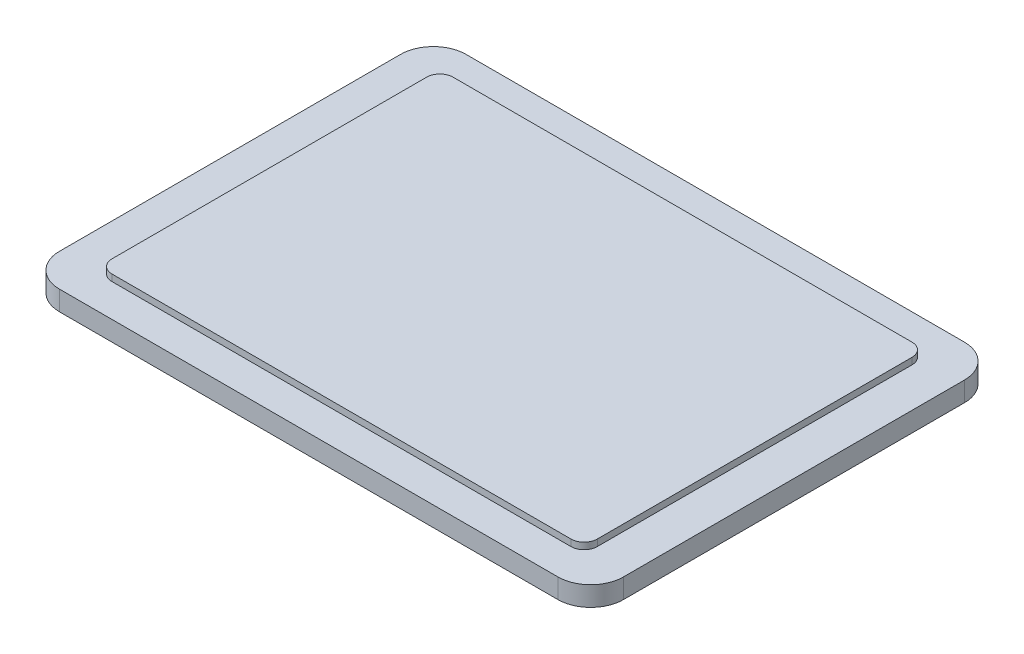
ISO-10303-21;
HEADER;
FILE_DESCRIPTION(('STEP AP214'),'2;1');
FILE_NAME('part.step','',(''),(''),'','','');
FILE_SCHEMA(('AUTOMOTIVE_DESIGN { 1 0 10303 214 1 1 1 1 }'));
ENDSEC;
DATA;
#1=APPLICATION_CONTEXT('core data for automotive mechanical design processes');
#2=APPLICATION_PROTOCOL_DEFINITION('international standard','automotive_design',2000,#1);
#3=PRODUCT_CONTEXT('',#1,'mechanical');
#4=PRODUCT('Part','Part','',(#3));
#5=PRODUCT_RELATED_PRODUCT_CATEGORY('part','',(#4));
#6=PRODUCT_DEFINITION_FORMATION('','',#4);
#7=PRODUCT_DEFINITION_CONTEXT('part definition',#1,'design');
#8=PRODUCT_DEFINITION('design','',#6,#7);
#9=PRODUCT_DEFINITION_SHAPE('','',#8);
#10=(LENGTH_UNIT() NAMED_UNIT(*) SI_UNIT(.MILLI.,.METRE.));
#11=(NAMED_UNIT(*) PLANE_ANGLE_UNIT() SI_UNIT($,.RADIAN.));
#12=(NAMED_UNIT(*) SI_UNIT($,.STERADIAN.) SOLID_ANGLE_UNIT());
#13=UNCERTAINTY_MEASURE_WITH_UNIT(LENGTH_MEASURE(1.E-05),#10,'distance_accuracy_value','');
#14=(GEOMETRIC_REPRESENTATION_CONTEXT(3) GLOBAL_UNCERTAINTY_ASSIGNED_CONTEXT((#13)) GLOBAL_UNIT_ASSIGNED_CONTEXT((#10,
#11,#12)) REPRESENTATION_CONTEXT('',''));
#15=CARTESIAN_POINT('',(0.,0.,0.));
#16=DIRECTION('',(0.,0.,1.));
#17=DIRECTION('',(1.,0.,0.));
#18=AXIS2_PLACEMENT_3D('',#15,#16,#17);
#19=CARTESIAN_POINT('',(-43.,3.,31.));
#20=DIRECTION('',(1.,0.,0.));
#21=DIRECTION('',(0.,0.,-1.));
#22=AXIS2_PLACEMENT_3D('',#19,#20,#21);
#23=PLANE('',#22);
#24=DIRECTION('',(0.,0.,1.));
#25=VECTOR('',#24,1.);
#26=CARTESIAN_POINT('',(-43.,3.,31.));
#27=LINE('',#26,#25);
#28=CARTESIAN_POINT('',(-43.,3.,-26.));
#29=VERTEX_POINT('',#28);
#30=CARTESIAN_POINT('',(-43.,3.,26.));
#31=VERTEX_POINT('',#30);
#32=EDGE_CURVE('E165',#29,#31,#27,.T.);
#33=ORIENTED_EDGE('',*,*,#32,.F.);
#34=DIRECTION('',(0.,-1.,0.));
#35=VECTOR('',#34,1.);
#36=CARTESIAN_POINT('',(-43.,3.,-26.));
#37=LINE('',#36,#35);
#38=CARTESIAN_POINT('',(-43.,0.,-26.));
#39=VERTEX_POINT('',#38);
#40=EDGE_CURVE('E150',#29,#39,#37,.T.);
#41=ORIENTED_EDGE('',*,*,#40,.T.);
#42=DIRECTION('',(0.,0.,1.));
#43=VECTOR('',#42,1.);
#44=CARTESIAN_POINT('',(-43.,0.,31.));
#45=LINE('',#44,#43);
#46=CARTESIAN_POINT('',(-43.,0.,26.));
#47=VERTEX_POINT('',#46);
#48=EDGE_CURVE('E162',#39,#47,#45,.T.);
#49=ORIENTED_EDGE('',*,*,#48,.T.);
#50=DIRECTION('',(0.,-1.,0.));
#51=VECTOR('',#50,1.);
#52=CARTESIAN_POINT('',(-43.,3.,26.));
#53=LINE('',#52,#51);
#54=EDGE_CURVE('E167',#47,#31,#53,.F.);
#55=ORIENTED_EDGE('',*,*,#54,.T.);
#56=EDGE_LOOP('',(#33,#41,#49,#55));
#57=FACE_BOUND('',#56,.T.);
#58=ADVANCED_FACE('F34',(#57),#23,.F.);
#59=CARTESIAN_POINT('',(43.,3.,31.));
#60=DIRECTION('',(0.,0.,-1.));
#61=DIRECTION('',(-1.,0.,0.));
#62=AXIS2_PLACEMENT_3D('',#59,#60,#61);
#63=PLANE('',#62);
#64=DIRECTION('',(1.,0.,0.));
#65=VECTOR('',#64,1.);
#66=CARTESIAN_POINT('',(43.,0.,31.));
#67=LINE('',#66,#65);
#68=CARTESIAN_POINT('',(-38.,0.,31.));
#69=VERTEX_POINT('',#68);
#70=CARTESIAN_POINT('',(38.,0.,31.));
#71=VERTEX_POINT('',#70);
#72=EDGE_CURVE('E171',#69,#71,#67,.T.);
#73=ORIENTED_EDGE('',*,*,#72,.T.);
#74=DIRECTION('',(0.,-1.,0.));
#75=VECTOR('',#74,1.);
#76=CARTESIAN_POINT('',(38.,3.,31.));
#77=LINE('',#76,#75);
#78=CARTESIAN_POINT('',(38.,3.,31.));
#79=VERTEX_POINT('',#78);
#80=EDGE_CURVE('E212',#71,#79,#77,.F.);
#81=ORIENTED_EDGE('',*,*,#80,.T.);
#82=DIRECTION('',(1.,0.,0.));
#83=VECTOR('',#82,1.);
#84=CARTESIAN_POINT('',(43.,3.,31.));
#85=LINE('',#84,#83);
#86=CARTESIAN_POINT('',(-38.,3.,31.));
#87=VERTEX_POINT('',#86);
#88=EDGE_CURVE('E288',#87,#79,#85,.T.);
#89=ORIENTED_EDGE('',*,*,#88,.F.);
#90=DIRECTION('',(0.,-1.,0.));
#91=VECTOR('',#90,1.);
#92=CARTESIAN_POINT('',(-38.,3.,31.));
#93=LINE('',#92,#91);
#94=EDGE_CURVE('E209',#87,#69,#93,.T.);
#95=ORIENTED_EDGE('',*,*,#94,.T.);
#96=EDGE_LOOP('',(#73,#81,#89,#95));
#97=FACE_BOUND('',#96,.T.);
#98=ADVANCED_FACE('F311',(#97),#63,.F.);
#99=CARTESIAN_POINT('',(43.,3.,31.));
#100=DIRECTION('',(-1.,0.,0.));
#101=DIRECTION('',(0.,0.,1.));
#102=AXIS2_PLACEMENT_3D('',#99,#100,#101);
#103=PLANE('',#102);
#104=DIRECTION('',(0.,0.,-1.));
#105=VECTOR('',#104,1.);
#106=CARTESIAN_POINT('',(43.,0.,31.));
#107=LINE('',#106,#105);
#108=CARTESIAN_POINT('',(43.,0.,26.));
#109=VERTEX_POINT('',#108);
#110=CARTESIAN_POINT('',(43.,0.,-26.));
#111=VERTEX_POINT('',#110);
#112=EDGE_CURVE('E175',#109,#111,#107,.T.);
#113=ORIENTED_EDGE('',*,*,#112,.T.);
#114=DIRECTION('',(0.,-1.,0.));
#115=VECTOR('',#114,1.);
#116=CARTESIAN_POINT('',(43.,3.,-26.));
#117=LINE('',#116,#115);
#118=CARTESIAN_POINT('',(43.,3.,-26.));
#119=VERTEX_POINT('',#118);
#120=EDGE_CURVE('E207',#111,#119,#117,.F.);
#121=ORIENTED_EDGE('',*,*,#120,.T.);
#122=DIRECTION('',(0.,0.,-1.));
#123=VECTOR('',#122,1.);
#124=CARTESIAN_POINT('',(43.,3.,31.));
#125=LINE('',#124,#123);
#126=CARTESIAN_POINT('',(43.,3.,26.));
#127=VERTEX_POINT('',#126);
#128=EDGE_CURVE('E290',#127,#119,#125,.T.);
#129=ORIENTED_EDGE('',*,*,#128,.F.);
#130=DIRECTION('',(0.,-1.,0.));
#131=VECTOR('',#130,1.);
#132=CARTESIAN_POINT('',(43.,3.,26.));
#133=LINE('',#132,#131);
#134=EDGE_CURVE('E204',#127,#109,#133,.T.);
#135=ORIENTED_EDGE('',*,*,#134,.T.);
#136=EDGE_LOOP('',(#113,#121,#129,#135));
#137=FACE_BOUND('',#136,.T.);
#138=ADVANCED_FACE('F304',(#137),#103,.F.);
#139=CARTESIAN_POINT('',(43.,3.,-31.));
#140=DIRECTION('',(0.,0.,1.));
#141=DIRECTION('',(1.,0.,0.));
#142=AXIS2_PLACEMENT_3D('',#139,#140,#141);
#143=PLANE('',#142);
#144=DIRECTION('',(-1.,0.,0.));
#145=VECTOR('',#144,1.);
#146=CARTESIAN_POINT('',(43.,0.,-31.));
#147=LINE('',#146,#145);
#148=CARTESIAN_POINT('',(38.,0.,-31.));
#149=VERTEX_POINT('',#148);
#150=CARTESIAN_POINT('',(-38.,0.,-31.));
#151=VERTEX_POINT('',#150);
#152=EDGE_CURVE('E186',#149,#151,#147,.T.);
#153=ORIENTED_EDGE('',*,*,#152,.T.);
#154=DIRECTION('',(0.,-1.,0.));
#155=VECTOR('',#154,1.);
#156=CARTESIAN_POINT('',(-38.,3.,-31.));
#157=LINE('',#156,#155);
#158=CARTESIAN_POINT('',(-38.,3.,-31.));
#159=VERTEX_POINT('',#158);
#160=EDGE_CURVE('E151',#151,#159,#157,.F.);
#161=ORIENTED_EDGE('',*,*,#160,.T.);
#162=DIRECTION('',(-1.,0.,0.));
#163=VECTOR('',#162,1.);
#164=CARTESIAN_POINT('',(43.,3.,-31.));
#165=LINE('',#164,#163);
#166=CARTESIAN_POINT('',(38.,3.,-31.));
#167=VERTEX_POINT('',#166);
#168=EDGE_CURVE('E181',#167,#159,#165,.T.);
#169=ORIENTED_EDGE('',*,*,#168,.F.);
#170=DIRECTION('',(0.,-1.,0.));
#171=VECTOR('',#170,1.);
#172=CARTESIAN_POINT('',(38.,3.,-31.));
#173=LINE('',#172,#171);
#174=EDGE_CURVE('E156',#167,#149,#173,.T.);
#175=ORIENTED_EDGE('',*,*,#174,.T.);
#176=EDGE_LOOP('',(#153,#161,#169,#175));
#177=FACE_BOUND('',#176,.T.);
#178=ADVANCED_FACE('F298',(#177),#143,.F.);
#179=CARTESIAN_POINT('',(0.,3.,0.));
#180=DIRECTION('',(0.,1.,0.));
#181=DIRECTION('',(0.,0.,1.));
#182=AXIS2_PLACEMENT_3D('',#179,#180,#181);
#183=PLANE('',#182);
#184=DIRECTION('',(0.,0.,1.));
#185=VECTOR('',#184,1.);
#186=CARTESIAN_POINT('',(-37.,3.,26.));
#187=LINE('',#186,#185);
#188=CARTESIAN_POINT('',(-37.,3.,-24.));
#189=VERTEX_POINT('',#188);
#190=CARTESIAN_POINT('',(-37.,3.,24.));
#191=VERTEX_POINT('',#190);
#192=EDGE_CURVE('E283',#189,#191,#187,.T.);
#193=ORIENTED_EDGE('',*,*,#192,.F.);
#194=CARTESIAN_POINT('',(-35.,3.,-24.));
#195=DIRECTION('',(0.,1.,0.));
#196=DIRECTION('',(0.,0.,1.));
#197=AXIS2_PLACEMENT_3D('',#194,#195,#196);
#198=CIRCLE('',#197,2.);
#199=CARTESIAN_POINT('',(-35.,3.,-26.));
#200=VERTEX_POINT('',#199);
#201=EDGE_CURVE('E11',#189,#200,#198,.F.);
#202=ORIENTED_EDGE('',*,*,#201,.T.);
#203=DIRECTION('',(-1.,0.,0.));
#204=VECTOR('',#203,1.);
#205=CARTESIAN_POINT('',(37.,3.,-26.));
#206=LINE('',#205,#204);
#207=CARTESIAN_POINT('',(35.,3.,-26.));
#208=VERTEX_POINT('',#207);
#209=EDGE_CURVE('E249',#208,#200,#206,.T.);
#210=ORIENTED_EDGE('',*,*,#209,.F.);
#211=CARTESIAN_POINT('',(35.,3.,-24.));
#212=DIRECTION('',(0.,1.,0.));
#213=DIRECTION('',(0.,0.,1.));
#214=AXIS2_PLACEMENT_3D('',#211,#212,#213);
#215=CIRCLE('',#214,2.);
#216=CARTESIAN_POINT('',(37.,3.,-24.));
#217=VERTEX_POINT('',#216);
#218=EDGE_CURVE('E42',#208,#217,#215,.F.);
#219=ORIENTED_EDGE('',*,*,#218,.T.);
#220=DIRECTION('',(0.,0.,-1.));
#221=VECTOR('',#220,1.);
#222=CARTESIAN_POINT('',(37.,3.,26.));
#223=LINE('',#222,#221);
#224=CARTESIAN_POINT('',(37.,3.,24.));
#225=VERTEX_POINT('',#224);
#226=EDGE_CURVE('E248',#225,#217,#223,.T.);
#227=ORIENTED_EDGE('',*,*,#226,.F.);
#228=CARTESIAN_POINT('',(35.,3.,24.));
#229=DIRECTION('',(0.,1.,0.));
#230=DIRECTION('',(0.,0.,1.));
#231=AXIS2_PLACEMENT_3D('',#228,#229,#230);
#232=CIRCLE('',#231,2.);
#233=CARTESIAN_POINT('',(35.,3.,26.));
#234=VERTEX_POINT('',#233);
#235=EDGE_CURVE('E241',#225,#234,#232,.F.);
#236=ORIENTED_EDGE('',*,*,#235,.T.);
#237=DIRECTION('',(1.,0.,0.));
#238=VECTOR('',#237,1.);
#239=CARTESIAN_POINT('',(37.,3.,26.));
#240=LINE('',#239,#238);
#241=CARTESIAN_POINT('',(-35.,3.,26.));
#242=VERTEX_POINT('',#241);
#243=EDGE_CURVE('E255',#242,#234,#240,.T.);
#244=ORIENTED_EDGE('',*,*,#243,.F.);
#245=CARTESIAN_POINT('',(-35.,3.,24.));
#246=DIRECTION('',(0.,1.,0.));
#247=DIRECTION('',(0.,0.,1.));
#248=AXIS2_PLACEMENT_3D('',#245,#246,#247);
#249=CIRCLE('',#248,2.);
#250=EDGE_CURVE('E243',#242,#191,#249,.F.);
#251=ORIENTED_EDGE('',*,*,#250,.T.);
#252=EDGE_LOOP('',(#193,#202,#210,#219,#227,#236,#244,#251));
#253=FACE_BOUND('',#252,.T.);
#254=ORIENTED_EDGE('',*,*,#168,.T.);
#255=CARTESIAN_POINT('',(-38.,3.,-26.));
#256=DIRECTION('',(0.,1.,0.));
#257=DIRECTION('',(0.,0.,1.));
#258=AXIS2_PLACEMENT_3D('',#255,#256,#257);
#259=CIRCLE('',#258,5.);
#260=EDGE_CURVE('E202',#159,#29,#259,.T.);
#261=ORIENTED_EDGE('',*,*,#260,.T.);
#262=ORIENTED_EDGE('',*,*,#32,.T.);
#263=CARTESIAN_POINT('',(-38.,3.,26.));
#264=DIRECTION('',(0.,1.,0.));
#265=DIRECTION('',(0.,0.,1.));
#266=AXIS2_PLACEMENT_3D('',#263,#264,#265);
#267=CIRCLE('',#266,5.);
#268=EDGE_CURVE('E196',#31,#87,#267,.T.);
#269=ORIENTED_EDGE('',*,*,#268,.T.);
#270=ORIENTED_EDGE('',*,*,#88,.T.);
#271=CARTESIAN_POINT('',(38.,3.,26.));
#272=DIRECTION('',(0.,1.,0.));
#273=DIRECTION('',(0.,0.,1.));
#274=AXIS2_PLACEMENT_3D('',#271,#272,#273);
#275=CIRCLE('',#274,5.);
#276=EDGE_CURVE('E198',#79,#127,#275,.T.);
#277=ORIENTED_EDGE('',*,*,#276,.T.);
#278=ORIENTED_EDGE('',*,*,#128,.T.);
#279=CARTESIAN_POINT('',(38.,3.,-26.));
#280=DIRECTION('',(0.,1.,0.));
#281=DIRECTION('',(0.,0.,1.));
#282=AXIS2_PLACEMENT_3D('',#279,#280,#281);
#283=CIRCLE('',#282,5.);
#284=EDGE_CURVE('E200',#119,#167,#283,.T.);
#285=ORIENTED_EDGE('',*,*,#284,.T.);
#286=EDGE_LOOP('',(#254,#261,#262,#269,#270,#277,#278,#285));
#287=FACE_BOUND('',#286,.T.);
#288=ADVANCED_FACE('F246',(#253,#287),#183,.T.);
#289=CARTESIAN_POINT('',(0.,0.,0.));
#290=DIRECTION('',(0.,1.,0.));
#291=DIRECTION('',(0.,0.,1.));
#292=AXIS2_PLACEMENT_3D('',#289,#290,#291);
#293=PLANE('',#292);
#294=ORIENTED_EDGE('',*,*,#48,.F.);
#295=CARTESIAN_POINT('',(-38.,0.,-26.));
#296=DIRECTION('',(0.,1.,0.));
#297=DIRECTION('',(0.,0.,1.));
#298=AXIS2_PLACEMENT_3D('',#295,#296,#297);
#299=CIRCLE('',#298,5.);
#300=EDGE_CURVE('E146',#39,#151,#299,.F.);
#301=ORIENTED_EDGE('',*,*,#300,.T.);
#302=ORIENTED_EDGE('',*,*,#152,.F.);
#303=CARTESIAN_POINT('',(38.,0.,-26.));
#304=DIRECTION('',(0.,1.,0.));
#305=DIRECTION('',(0.,0.,1.));
#306=AXIS2_PLACEMENT_3D('',#303,#304,#305);
#307=CIRCLE('',#306,5.);
#308=EDGE_CURVE('E157',#149,#111,#307,.F.);
#309=ORIENTED_EDGE('',*,*,#308,.T.);
#310=ORIENTED_EDGE('',*,*,#112,.F.);
#311=CARTESIAN_POINT('',(38.,0.,26.));
#312=DIRECTION('',(0.,1.,0.));
#313=DIRECTION('',(0.,0.,1.));
#314=AXIS2_PLACEMENT_3D('',#311,#312,#313);
#315=CIRCLE('',#314,5.);
#316=EDGE_CURVE('E190',#109,#71,#315,.F.);
#317=ORIENTED_EDGE('',*,*,#316,.T.);
#318=ORIENTED_EDGE('',*,*,#72,.F.);
#319=CARTESIAN_POINT('',(-38.,0.,26.));
#320=DIRECTION('',(0.,1.,0.));
#321=DIRECTION('',(0.,0.,1.));
#322=AXIS2_PLACEMENT_3D('',#319,#320,#321);
#323=CIRCLE('',#322,5.);
#324=EDGE_CURVE('E166',#69,#47,#323,.F.);
#325=ORIENTED_EDGE('',*,*,#324,.T.);
#326=EDGE_LOOP('',(#294,#301,#302,#309,#310,#317,#318,#325));
#327=FACE_BOUND('',#326,.T.);
#328=ADVANCED_FACE('F169',(#327),#293,.F.);
#329=CARTESIAN_POINT('',(-37.,4.,26.));
#330=DIRECTION('',(1.,0.,0.));
#331=DIRECTION('',(0.,0.,-1.));
#332=AXIS2_PLACEMENT_3D('',#329,#330,#331);
#333=PLANE('',#332);
#334=ORIENTED_EDGE('',*,*,#192,.T.);
#335=DIRECTION('',(0.,-1.,0.));
#336=VECTOR('',#335,1.);
#337=CARTESIAN_POINT('',(-37.,4.,24.));
#338=LINE('',#337,#336);
#339=CARTESIAN_POINT('',(-37.,4.,24.));
#340=VERTEX_POINT('',#339);
#341=EDGE_CURVE('E235',#191,#340,#338,.F.);
#342=ORIENTED_EDGE('',*,*,#341,.T.);
#343=DIRECTION('',(0.,0.,1.));
#344=VECTOR('',#343,1.);
#345=CARTESIAN_POINT('',(-37.,4.,26.));
#346=LINE('',#345,#344);
#347=CARTESIAN_POINT('',(-37.,4.,-24.));
#348=VERTEX_POINT('',#347);
#349=EDGE_CURVE('E271',#348,#340,#346,.T.);
#350=ORIENTED_EDGE('',*,*,#349,.F.);
#351=DIRECTION('',(0.,-1.,0.));
#352=VECTOR('',#351,1.);
#353=CARTESIAN_POINT('',(-37.,4.,-24.));
#354=LINE('',#353,#352);
#355=EDGE_CURVE('E232',#348,#189,#354,.T.);
#356=ORIENTED_EDGE('',*,*,#355,.T.);
#357=EDGE_LOOP('',(#334,#342,#350,#356));
#358=FACE_BOUND('',#357,.T.);
#359=ADVANCED_FACE('F275',(#358),#333,.F.);
#360=CARTESIAN_POINT('',(37.,4.,26.));
#361=DIRECTION('',(0.,0.,-1.));
#362=DIRECTION('',(-1.,0.,0.));
#363=AXIS2_PLACEMENT_3D('',#360,#361,#362);
#364=PLANE('',#363);
#365=ORIENTED_EDGE('',*,*,#243,.T.);
#366=DIRECTION('',(0.,-1.,0.));
#367=VECTOR('',#366,1.);
#368=CARTESIAN_POINT('',(35.,4.,26.));
#369=LINE('',#368,#367);
#370=CARTESIAN_POINT('',(35.,4.,26.));
#371=VERTEX_POINT('',#370);
#372=EDGE_CURVE('E222',#234,#371,#369,.F.);
#373=ORIENTED_EDGE('',*,*,#372,.T.);
#374=DIRECTION('',(1.,0.,0.));
#375=VECTOR('',#374,1.);
#376=CARTESIAN_POINT('',(37.,4.,26.));
#377=LINE('',#376,#375);
#378=CARTESIAN_POINT('',(-35.,4.,26.));
#379=VERTEX_POINT('',#378);
#380=EDGE_CURVE('E277',#379,#371,#377,.T.);
#381=ORIENTED_EDGE('',*,*,#380,.F.);
#382=DIRECTION('',(0.,-1.,0.));
#383=VECTOR('',#382,1.);
#384=CARTESIAN_POINT('',(-35.,4.,26.));
#385=LINE('',#384,#383);
#386=EDGE_CURVE('E219',#379,#242,#385,.T.);
#387=ORIENTED_EDGE('',*,*,#386,.T.);
#388=EDGE_LOOP('',(#365,#373,#381,#387));
#389=FACE_BOUND('',#388,.T.);
#390=ADVANCED_FACE('F374',(#389),#364,.F.);
#391=CARTESIAN_POINT('',(37.,4.,26.));
#392=DIRECTION('',(-1.,0.,0.));
#393=DIRECTION('',(0.,0.,1.));
#394=AXIS2_PLACEMENT_3D('',#391,#392,#393);
#395=PLANE('',#394);
#396=DIRECTION('',(0.,0.,-1.));
#397=VECTOR('',#396,1.);
#398=CARTESIAN_POINT('',(37.,4.,26.));
#399=LINE('',#398,#397);
#400=CARTESIAN_POINT('',(37.,4.,24.));
#401=VERTEX_POINT('',#400);
#402=CARTESIAN_POINT('',(37.,4.,-24.));
#403=VERTEX_POINT('',#402);
#404=EDGE_CURVE('E178',#401,#403,#399,.T.);
#405=ORIENTED_EDGE('',*,*,#404,.F.);
#406=DIRECTION('',(0.,-1.,0.));
#407=VECTOR('',#406,1.);
#408=CARTESIAN_POINT('',(37.,4.,24.));
#409=LINE('',#408,#407);
#410=EDGE_CURVE('E216',#401,#225,#409,.T.);
#411=ORIENTED_EDGE('',*,*,#410,.T.);
#412=ORIENTED_EDGE('',*,*,#226,.T.);
#413=DIRECTION('',(0.,-1.,0.));
#414=VECTOR('',#413,1.);
#415=CARTESIAN_POINT('',(37.,4.,-24.));
#416=LINE('',#415,#414);
#417=EDGE_CURVE('E214',#217,#403,#416,.F.);
#418=ORIENTED_EDGE('',*,*,#417,.T.);
#419=EDGE_LOOP('',(#405,#411,#412,#418));
#420=FACE_BOUND('',#419,.T.);
#421=ADVANCED_FACE('F252',(#420),#395,.F.);
#422=CARTESIAN_POINT('',(37.,4.,-26.));
#423=DIRECTION('',(0.,0.,1.));
#424=DIRECTION('',(1.,0.,0.));
#425=AXIS2_PLACEMENT_3D('',#422,#423,#424);
#426=PLANE('',#425);
#427=DIRECTION('',(-1.,0.,0.));
#428=VECTOR('',#427,1.);
#429=CARTESIAN_POINT('',(37.,4.,-26.));
#430=LINE('',#429,#428);
#431=CARTESIAN_POINT('',(35.,4.,-26.));
#432=VERTEX_POINT('',#431);
#433=CARTESIAN_POINT('',(-35.,4.,-26.));
#434=VERTEX_POINT('',#433);
#435=EDGE_CURVE('E172',#432,#434,#430,.T.);
#436=ORIENTED_EDGE('',*,*,#435,.F.);
#437=DIRECTION('',(0.,-1.,0.));
#438=VECTOR('',#437,1.);
#439=CARTESIAN_POINT('',(35.,4.,-26.));
#440=LINE('',#439,#438);
#441=EDGE_CURVE('E239',#432,#208,#440,.T.);
#442=ORIENTED_EDGE('',*,*,#441,.T.);
#443=ORIENTED_EDGE('',*,*,#209,.T.);
#444=DIRECTION('',(0.,-1.,0.));
#445=VECTOR('',#444,1.);
#446=CARTESIAN_POINT('',(-35.,4.,-26.));
#447=LINE('',#446,#445);
#448=EDGE_CURVE('E237',#200,#434,#447,.F.);
#449=ORIENTED_EDGE('',*,*,#448,.T.);
#450=EDGE_LOOP('',(#436,#442,#443,#449));
#451=FACE_BOUND('',#450,.T.);
#452=ADVANCED_FACE('F265',(#451),#426,.F.);
#453=CARTESIAN_POINT('',(0.,4.,0.));
#454=DIRECTION('',(0.,1.,0.));
#455=DIRECTION('',(0.,0.,1.));
#456=AXIS2_PLACEMENT_3D('',#453,#454,#455);
#457=PLANE('',#456);
#458=ORIENTED_EDGE('',*,*,#380,.T.);
#459=CARTESIAN_POINT('',(35.,4.,24.));
#460=DIRECTION('',(0.,1.,0.));
#461=DIRECTION('',(0.,0.,1.));
#462=AXIS2_PLACEMENT_3D('',#459,#460,#461);
#463=CIRCLE('',#462,2.);
#464=EDGE_CURVE('E230',#371,#401,#463,.T.);
#465=ORIENTED_EDGE('',*,*,#464,.T.);
#466=ORIENTED_EDGE('',*,*,#404,.T.);
#467=CARTESIAN_POINT('',(35.,4.,-24.));
#468=DIRECTION('',(0.,1.,0.));
#469=DIRECTION('',(0.,0.,1.));
#470=AXIS2_PLACEMENT_3D('',#467,#468,#469);
#471=CIRCLE('',#470,2.);
#472=EDGE_CURVE('E226',#403,#432,#471,.T.);
#473=ORIENTED_EDGE('',*,*,#472,.T.);
#474=ORIENTED_EDGE('',*,*,#435,.T.);
#475=CARTESIAN_POINT('',(-35.,4.,-24.));
#476=DIRECTION('',(0.,1.,0.));
#477=DIRECTION('',(0.,0.,1.));
#478=AXIS2_PLACEMENT_3D('',#475,#476,#477);
#479=CIRCLE('',#478,2.);
#480=EDGE_CURVE('E224',#434,#348,#479,.T.);
#481=ORIENTED_EDGE('',*,*,#480,.T.);
#482=ORIENTED_EDGE('',*,*,#349,.T.);
#483=CARTESIAN_POINT('',(-35.,4.,24.));
#484=DIRECTION('',(0.,1.,0.));
#485=DIRECTION('',(0.,0.,1.));
#486=AXIS2_PLACEMENT_3D('',#483,#484,#485);
#487=CIRCLE('',#486,2.);
#488=EDGE_CURVE('E228',#340,#379,#487,.T.);
#489=ORIENTED_EDGE('',*,*,#488,.T.);
#490=EDGE_LOOP('',(#458,#465,#466,#473,#474,#481,#482,#489));
#491=FACE_BOUND('',#490,.T.);
#492=ADVANCED_FACE('F262',(#491),#457,.T.);
#493=CARTESIAN_POINT('',(-38.,3.,-26.));
#494=DIRECTION('',(0.,-1.,0.));
#495=DIRECTION('',(0.,0.,-1.));
#496=AXIS2_PLACEMENT_3D('',#493,#494,#495);
#497=CYLINDRICAL_SURFACE('',#496,5.);
#498=ORIENTED_EDGE('',*,*,#260,.F.);
#499=ORIENTED_EDGE('',*,*,#160,.F.);
#500=ORIENTED_EDGE('',*,*,#300,.F.);
#501=ORIENTED_EDGE('',*,*,#40,.F.);
#502=EDGE_LOOP('',(#498,#499,#500,#501));
#503=FACE_BOUND('',#502,.T.);
#504=ADVANCED_FACE('F149',(#503),#497,.T.);
#505=CARTESIAN_POINT('',(38.,3.,-26.));
#506=DIRECTION('',(0.,-1.,0.));
#507=DIRECTION('',(0.,0.,-1.));
#508=AXIS2_PLACEMENT_3D('',#505,#506,#507);
#509=CYLINDRICAL_SURFACE('',#508,5.);
#510=ORIENTED_EDGE('',*,*,#284,.F.);
#511=ORIENTED_EDGE('',*,*,#120,.F.);
#512=ORIENTED_EDGE('',*,*,#308,.F.);
#513=ORIENTED_EDGE('',*,*,#174,.F.);
#514=EDGE_LOOP('',(#510,#511,#512,#513));
#515=FACE_BOUND('',#514,.T.);
#516=ADVANCED_FACE('F300',(#515),#509,.T.);
#517=CARTESIAN_POINT('',(38.,3.,26.));
#518=DIRECTION('',(0.,-1.,0.));
#519=DIRECTION('',(0.,0.,-1.));
#520=AXIS2_PLACEMENT_3D('',#517,#518,#519);
#521=CYLINDRICAL_SURFACE('',#520,5.);
#522=ORIENTED_EDGE('',*,*,#276,.F.);
#523=ORIENTED_EDGE('',*,*,#80,.F.);
#524=ORIENTED_EDGE('',*,*,#316,.F.);
#525=ORIENTED_EDGE('',*,*,#134,.F.);
#526=EDGE_LOOP('',(#522,#523,#524,#525));
#527=FACE_BOUND('',#526,.T.);
#528=ADVANCED_FACE('F308',(#527),#521,.T.);
#529=CARTESIAN_POINT('',(-38.,3.,26.));
#530=DIRECTION('',(0.,-1.,0.));
#531=DIRECTION('',(0.,0.,-1.));
#532=AXIS2_PLACEMENT_3D('',#529,#530,#531);
#533=CYLINDRICAL_SURFACE('',#532,5.);
#534=ORIENTED_EDGE('',*,*,#268,.F.);
#535=ORIENTED_EDGE('',*,*,#54,.F.);
#536=ORIENTED_EDGE('',*,*,#324,.F.);
#537=ORIENTED_EDGE('',*,*,#94,.F.);
#538=EDGE_LOOP('',(#534,#535,#536,#537));
#539=FACE_BOUND('',#538,.T.);
#540=ADVANCED_FACE('F316',(#539),#533,.T.);
#541=CARTESIAN_POINT('',(35.,4.,24.));
#542=DIRECTION('',(0.,-1.,0.));
#543=DIRECTION('',(0.,0.,-1.));
#544=AXIS2_PLACEMENT_3D('',#541,#542,#543);
#545=CYLINDRICAL_SURFACE('',#544,2.);
#546=ORIENTED_EDGE('',*,*,#464,.F.);
#547=ORIENTED_EDGE('',*,*,#372,.F.);
#548=ORIENTED_EDGE('',*,*,#235,.F.);
#549=ORIENTED_EDGE('',*,*,#410,.F.);
#550=EDGE_LOOP('',(#546,#547,#548,#549));
#551=FACE_BOUND('',#550,.T.);
#552=ADVANCED_FACE('F318',(#551),#545,.T.);
#553=CARTESIAN_POINT('',(-35.,4.,24.));
#554=DIRECTION('',(0.,-1.,0.));
#555=DIRECTION('',(0.,0.,-1.));
#556=AXIS2_PLACEMENT_3D('',#553,#554,#555);
#557=CYLINDRICAL_SURFACE('',#556,2.);
#558=ORIENTED_EDGE('',*,*,#488,.F.);
#559=ORIENTED_EDGE('',*,*,#341,.F.);
#560=ORIENTED_EDGE('',*,*,#250,.F.);
#561=ORIENTED_EDGE('',*,*,#386,.F.);
#562=EDGE_LOOP('',(#558,#559,#560,#561));
#563=FACE_BOUND('',#562,.T.);
#564=ADVANCED_FACE('F324',(#563),#557,.T.);
#565=CARTESIAN_POINT('',(35.,4.,-24.));
#566=DIRECTION('',(0.,-1.,0.));
#567=DIRECTION('',(0.,0.,-1.));
#568=AXIS2_PLACEMENT_3D('',#565,#566,#567);
#569=CYLINDRICAL_SURFACE('',#568,2.);
#570=ORIENTED_EDGE('',*,*,#472,.F.);
#571=ORIENTED_EDGE('',*,*,#417,.F.);
#572=ORIENTED_EDGE('',*,*,#218,.F.);
#573=ORIENTED_EDGE('',*,*,#441,.F.);
#574=EDGE_LOOP('',(#570,#571,#572,#573));
#575=FACE_BOUND('',#574,.T.);
#576=ADVANCED_FACE('F258',(#575),#569,.T.);
#577=CARTESIAN_POINT('',(-35.,4.,-24.));
#578=DIRECTION('',(0.,-1.,0.));
#579=DIRECTION('',(0.,0.,-1.));
#580=AXIS2_PLACEMENT_3D('',#577,#578,#579);
#581=CYLINDRICAL_SURFACE('',#580,2.);
#582=ORIENTED_EDGE('',*,*,#480,.F.);
#583=ORIENTED_EDGE('',*,*,#448,.F.);
#584=ORIENTED_EDGE('',*,*,#201,.F.);
#585=ORIENTED_EDGE('',*,*,#355,.F.);
#586=EDGE_LOOP('',(#582,#583,#584,#585));
#587=FACE_BOUND('',#586,.T.);
#588=ADVANCED_FACE('F36',(#587),#581,.T.);
#589=CLOSED_SHELL('',(#58,#98,#138,#178,#288,#328,#359,#390,#421,#452,#492,#504,#516,#528,#540,
#552,#564,#576,#588));
#590=MANIFOLD_SOLID_BREP('B2',#589);
#591=ADVANCED_BREP_SHAPE_REPRESENTATION('',(#18,#590),#14);
#592=SHAPE_DEFINITION_REPRESENTATION(#9,#591);
ENDSEC;
END-ISO-10303-21;
